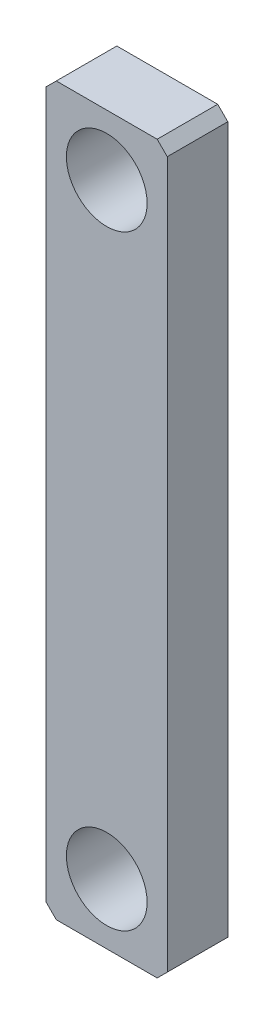
ISO-10303-21;
HEADER;
FILE_DESCRIPTION(('STEP AP214'),'2;1');
FILE_NAME('part.step','',(''),(''),'','','');
FILE_SCHEMA(('AUTOMOTIVE_DESIGN { 1 0 10303 214 1 1 1 1 }'));
ENDSEC;
DATA;
#1=APPLICATION_CONTEXT('core data for automotive mechanical design processes');
#2=APPLICATION_PROTOCOL_DEFINITION('international standard','automotive_design',2000,#1);
#3=PRODUCT_CONTEXT('',#1,'mechanical');
#4=PRODUCT('Part','Part','',(#3));
#5=PRODUCT_RELATED_PRODUCT_CATEGORY('part','',(#4));
#6=PRODUCT_DEFINITION_FORMATION('','',#4);
#7=PRODUCT_DEFINITION_CONTEXT('part definition',#1,'design');
#8=PRODUCT_DEFINITION('design','',#6,#7);
#9=PRODUCT_DEFINITION_SHAPE('','',#8);
#10=(LENGTH_UNIT() NAMED_UNIT(*) SI_UNIT(.MILLI.,.METRE.));
#11=(NAMED_UNIT(*) PLANE_ANGLE_UNIT() SI_UNIT($,.RADIAN.));
#12=(NAMED_UNIT(*) SI_UNIT($,.STERADIAN.) SOLID_ANGLE_UNIT());
#13=UNCERTAINTY_MEASURE_WITH_UNIT(LENGTH_MEASURE(1.E-05),#10,'distance_accuracy_value','');
#14=(GEOMETRIC_REPRESENTATION_CONTEXT(3) GLOBAL_UNCERTAINTY_ASSIGNED_CONTEXT((#13)) GLOBAL_UNIT_ASSIGNED_CONTEXT((#10,
#11,#12)) REPRESENTATION_CONTEXT('',''));
#15=CARTESIAN_POINT('',(0.,0.,0.));
#16=DIRECTION('',(0.,0.,1.));
#17=DIRECTION('',(1.,0.,0.));
#18=AXIS2_PLACEMENT_3D('',#15,#16,#17);
#19=CARTESIAN_POINT('',(6.,36.,6.));
#20=DIRECTION('',(-1.,0.,0.));
#21=DIRECTION('',(0.,-1.,0.));
#22=AXIS2_PLACEMENT_3D('',#19,#20,#21);
#23=PLANE('',#22);
#24=DIRECTION('',(0.,1.,0.));
#25=VECTOR('',#24,1.);
#26=CARTESIAN_POINT('',(6.,36.,6.));
#27=LINE('',#26,#25);
#28=CARTESIAN_POINT('',(6.,-35.,6.));
#29=VERTEX_POINT('',#28);
#30=CARTESIAN_POINT('',(6.,35.,6.));
#31=VERTEX_POINT('',#30);
#32=EDGE_CURVE('E131',#29,#31,#27,.T.);
#33=ORIENTED_EDGE('',*,*,#32,.F.);
#34=DIRECTION('',(0.,0.,-1.));
#35=VECTOR('',#34,1.);
#36=CARTESIAN_POINT('',(6.,-35.,6.));
#37=LINE('',#36,#35);
#38=CARTESIAN_POINT('',(6.,-35.,0.));
#39=VERTEX_POINT('',#38);
#40=EDGE_CURVE('E116',#29,#39,#37,.T.);
#41=ORIENTED_EDGE('',*,*,#40,.T.);
#42=DIRECTION('',(0.,1.,0.));
#43=VECTOR('',#42,1.);
#44=CARTESIAN_POINT('',(6.,36.,0.));
#45=LINE('',#44,#43);
#46=CARTESIAN_POINT('',(6.,35.,0.));
#47=VERTEX_POINT('',#46);
#48=EDGE_CURVE('E128',#39,#47,#45,.T.);
#49=ORIENTED_EDGE('',*,*,#48,.T.);
#50=DIRECTION('',(0.,0.,1.));
#51=VECTOR('',#50,1.);
#52=CARTESIAN_POINT('',(6.,35.,6.));
#53=LINE('',#52,#51);
#54=EDGE_CURVE('E133',#47,#31,#53,.T.);
#55=ORIENTED_EDGE('',*,*,#54,.T.);
#56=EDGE_LOOP('',(#33,#41,#49,#55));
#57=FACE_BOUND('',#56,.T.);
#58=ADVANCED_FACE('F45',(#57),#23,.F.);
#59=CARTESIAN_POINT('',(-6.00000000000001,36.,6.));
#60=DIRECTION('',(0.,-1.,0.));
#61=DIRECTION('',(0.,0.,-1.));
#62=AXIS2_PLACEMENT_3D('',#59,#60,#61);
#63=PLANE('',#62);
#64=DIRECTION('',(-1.,0.,0.));
#65=VECTOR('',#64,1.);
#66=CARTESIAN_POINT('',(-6.00000000000001,36.,0.));
#67=LINE('',#66,#65);
#68=CARTESIAN_POINT('',(4.99999999999999,36.,0.));
#69=VERTEX_POINT('',#68);
#70=CARTESIAN_POINT('',(-4.99999999999999,36.,0.));
#71=VERTEX_POINT('',#70);
#72=EDGE_CURVE('E137',#69,#71,#67,.T.);
#73=ORIENTED_EDGE('',*,*,#72,.T.);
#74=DIRECTION('',(0.,0.,1.));
#75=VECTOR('',#74,1.);
#76=CARTESIAN_POINT('',(-4.99999999999998,36.,6.));
#77=LINE('',#76,#75);
#78=CARTESIAN_POINT('',(-4.99999999999999,36.,6.));
#79=VERTEX_POINT('',#78);
#80=EDGE_CURVE('E11',#71,#79,#77,.T.);
#81=ORIENTED_EDGE('',*,*,#80,.T.);
#82=DIRECTION('',(-1.,0.,0.));
#83=VECTOR('',#82,1.);
#84=CARTESIAN_POINT('',(-6.00000000000001,36.,6.));
#85=LINE('',#84,#83);
#86=CARTESIAN_POINT('',(4.99999999999999,36.,6.));
#87=VERTEX_POINT('',#86);
#88=EDGE_CURVE('E177',#87,#79,#85,.T.);
#89=ORIENTED_EDGE('',*,*,#88,.F.);
#90=DIRECTION('',(0.,0.,-1.));
#91=VECTOR('',#90,1.);
#92=CARTESIAN_POINT('',(4.99999999999999,36.,6.));
#93=LINE('',#92,#91);
#94=EDGE_CURVE('E54',#87,#69,#93,.T.);
#95=ORIENTED_EDGE('',*,*,#94,.T.);
#96=EDGE_LOOP('',(#73,#81,#89,#95));
#97=FACE_BOUND('',#96,.T.);
#98=ADVANCED_FACE('F175',(#97),#63,.F.);
#99=CARTESIAN_POINT('',(-6.00000000000001,36.,6.));
#100=DIRECTION('',(1.,0.,0.));
#101=DIRECTION('',(0.,1.,0.));
#102=AXIS2_PLACEMENT_3D('',#99,#100,#101);
#103=PLANE('',#102);
#104=DIRECTION('',(0.,-1.,0.));
#105=VECTOR('',#104,1.);
#106=CARTESIAN_POINT('',(-6.00000000000001,36.,0.));
#107=LINE('',#106,#105);
#108=CARTESIAN_POINT('',(-6.00000000000001,35.,0.));
#109=VERTEX_POINT('',#108);
#110=CARTESIAN_POINT('',(-6.,-35.,0.));
#111=VERTEX_POINT('',#110);
#112=EDGE_CURVE('E141',#109,#111,#107,.T.);
#113=ORIENTED_EDGE('',*,*,#112,.T.);
#114=DIRECTION('',(0.,0.,1.));
#115=VECTOR('',#114,1.);
#116=CARTESIAN_POINT('',(-6.,-35.,6.));
#117=LINE('',#116,#115);
#118=CARTESIAN_POINT('',(-6.,-35.,6.));
#119=VERTEX_POINT('',#118);
#120=EDGE_CURVE('E61',#111,#119,#117,.T.);
#121=ORIENTED_EDGE('',*,*,#120,.T.);
#122=DIRECTION('',(0.,-1.,0.));
#123=VECTOR('',#122,1.);
#124=CARTESIAN_POINT('',(-6.00000000000001,36.,6.));
#125=LINE('',#124,#123);
#126=CARTESIAN_POINT('',(-6.00000000000001,35.,6.));
#127=VERTEX_POINT('',#126);
#128=EDGE_CURVE('E185',#127,#119,#125,.T.);
#129=ORIENTED_EDGE('',*,*,#128,.F.);
#130=DIRECTION('',(0.,0.,-1.));
#131=VECTOR('',#130,1.);
#132=CARTESIAN_POINT('',(-6.00000000000001,35.,6.));
#133=LINE('',#132,#131);
#134=EDGE_CURVE('E168',#127,#109,#133,.T.);
#135=ORIENTED_EDGE('',*,*,#134,.T.);
#136=EDGE_LOOP('',(#113,#121,#129,#135));
#137=FACE_BOUND('',#136,.T.);
#138=ADVANCED_FACE('F184',(#137),#103,.F.);
#139=CARTESIAN_POINT('',(-6.,-36.,6.));
#140=DIRECTION('',(0.,1.,0.));
#141=DIRECTION('',(0.,0.,1.));
#142=AXIS2_PLACEMENT_3D('',#139,#140,#141);
#143=PLANE('',#142);
#144=DIRECTION('',(1.,0.,0.));
#145=VECTOR('',#144,1.);
#146=CARTESIAN_POINT('',(-6.,-36.,0.));
#147=LINE('',#146,#145);
#148=CARTESIAN_POINT('',(-5.,-36.,0.));
#149=VERTEX_POINT('',#148);
#150=CARTESIAN_POINT('',(5.,-36.,0.));
#151=VERTEX_POINT('',#150);
#152=EDGE_CURVE('E151',#149,#151,#147,.T.);
#153=ORIENTED_EDGE('',*,*,#152,.T.);
#154=DIRECTION('',(0.,0.,1.));
#155=VECTOR('',#154,1.);
#156=CARTESIAN_POINT('',(5.,-36.,6.));
#157=LINE('',#156,#155);
#158=CARTESIAN_POINT('',(5.,-36.,6.));
#159=VERTEX_POINT('',#158);
#160=EDGE_CURVE('E117',#151,#159,#157,.T.);
#161=ORIENTED_EDGE('',*,*,#160,.T.);
#162=DIRECTION('',(1.,0.,0.));
#163=VECTOR('',#162,1.);
#164=CARTESIAN_POINT('',(-6.,-36.,6.));
#165=LINE('',#164,#163);
#166=CARTESIAN_POINT('',(-5.,-36.,6.));
#167=VERTEX_POINT('',#166);
#168=EDGE_CURVE('E147',#167,#159,#165,.T.);
#169=ORIENTED_EDGE('',*,*,#168,.F.);
#170=DIRECTION('',(0.,0.,-1.));
#171=VECTOR('',#170,1.);
#172=CARTESIAN_POINT('',(-5.,-36.,6.));
#173=LINE('',#172,#171);
#174=EDGE_CURVE('E122',#167,#149,#173,.T.);
#175=ORIENTED_EDGE('',*,*,#174,.T.);
#176=EDGE_LOOP('',(#153,#161,#169,#175));
#177=FACE_BOUND('',#176,.T.);
#178=ADVANCED_FACE('F244',(#177),#143,.F.);
#179=CARTESIAN_POINT('',(0.,0.,6.));
#180=DIRECTION('',(0.,0.,1.));
#181=DIRECTION('',(1.,0.,0.));
#182=AXIS2_PLACEMENT_3D('',#179,#180,#181);
#183=PLANE('',#182);
#184=CARTESIAN_POINT('',(0.,30.,6.));
#185=DIRECTION('',(0.,0.,1.));
#186=DIRECTION('',(1.,0.,0.));
#187=AXIS2_PLACEMENT_3D('',#184,#185,#186);
#188=CIRCLE('',#187,4.);
#189=CARTESIAN_POINT('',(4.,30.,6.));
#190=VERTEX_POINT('',#189);
#191=EDGE_CURVE('E138',#190,#190,#188,.T.);
#192=ORIENTED_EDGE('',*,*,#191,.F.);
#193=EDGE_LOOP('',(#192));
#194=FACE_BOUND('',#193,.T.);
#195=CARTESIAN_POINT('',(0.,-30.,6.));
#196=DIRECTION('',(0.,0.,1.));
#197=DIRECTION('',(1.,0.,0.));
#198=AXIS2_PLACEMENT_3D('',#195,#196,#197);
#199=CIRCLE('',#198,4.);
#200=CARTESIAN_POINT('',(4.,-30.,6.));
#201=VERTEX_POINT('',#200);
#202=EDGE_CURVE('E144',#201,#201,#199,.T.);
#203=ORIENTED_EDGE('',*,*,#202,.F.);
#204=EDGE_LOOP('',(#203));
#205=FACE_BOUND('',#204,.T.);
#206=ORIENTED_EDGE('',*,*,#168,.T.);
#207=DIRECTION('',(-0.707106781186552,-0.707106781186543,0.));
#208=VECTOR('',#207,1.);
#209=CARTESIAN_POINT('',(20.5,-20.5000000000002,6.));
#210=LINE('',#209,#208);
#211=EDGE_CURVE('E166',#159,#29,#210,.F.);
#212=ORIENTED_EDGE('',*,*,#211,.T.);
#213=ORIENTED_EDGE('',*,*,#32,.T.);
#214=DIRECTION('',(0.707106781186545,-0.70710678118655,0.));
#215=VECTOR('',#214,1.);
#216=CARTESIAN_POINT('',(20.5,20.4999999999999,6.));
#217=LINE('',#216,#215);
#218=EDGE_CURVE('E161',#31,#87,#217,.F.);
#219=ORIENTED_EDGE('',*,*,#218,.T.);
#220=ORIENTED_EDGE('',*,*,#88,.T.);
#221=DIRECTION('',(0.707106781186552,0.707106781186543,0.));
#222=VECTOR('',#221,1.);
#223=CARTESIAN_POINT('',(-20.5,20.5000000000002,6.));
#224=LINE('',#223,#222);
#225=EDGE_CURVE('E68',#79,#127,#224,.F.);
#226=ORIENTED_EDGE('',*,*,#225,.T.);
#227=ORIENTED_EDGE('',*,*,#128,.T.);
#228=DIRECTION('',(-0.707106781186543,0.707106781186552,0.));
#229=VECTOR('',#228,1.);
#230=CARTESIAN_POINT('',(-20.5,-20.4999999999997,6.));
#231=LINE('',#230,#229);
#232=EDGE_CURVE('E164',#119,#167,#231,.F.);
#233=ORIENTED_EDGE('',*,*,#232,.T.);
#234=EDGE_LOOP('',(#206,#212,#213,#219,#220,#226,#227,#233));
#235=FACE_BOUND('',#234,.T.);
#236=ADVANCED_FACE('F240',(#194,#205,#235),#183,.T.);
#237=CARTESIAN_POINT('',(0.,0.,0.));
#238=DIRECTION('',(0.,0.,1.));
#239=DIRECTION('',(1.,0.,0.));
#240=AXIS2_PLACEMENT_3D('',#237,#238,#239);
#241=PLANE('',#240);
#242=CARTESIAN_POINT('',(0.,30.,0.));
#243=DIRECTION('',(0.,0.,1.));
#244=DIRECTION('',(1.,0.,0.));
#245=AXIS2_PLACEMENT_3D('',#242,#243,#244);
#246=CIRCLE('',#245,4.);
#247=CARTESIAN_POINT('',(4.,30.,0.));
#248=VERTEX_POINT('',#247);
#249=EDGE_CURVE('E193',#248,#248,#246,.T.);
#250=ORIENTED_EDGE('',*,*,#249,.T.);
#251=EDGE_LOOP('',(#250));
#252=FACE_BOUND('',#251,.T.);
#253=CARTESIAN_POINT('',(0.,-30.,0.));
#254=DIRECTION('',(0.,0.,1.));
#255=DIRECTION('',(1.,0.,0.));
#256=AXIS2_PLACEMENT_3D('',#253,#254,#255);
#257=CIRCLE('',#256,4.);
#258=CARTESIAN_POINT('',(4.,-30.,0.));
#259=VERTEX_POINT('',#258);
#260=EDGE_CURVE('E194',#259,#259,#257,.T.);
#261=ORIENTED_EDGE('',*,*,#260,.T.);
#262=EDGE_LOOP('',(#261));
#263=FACE_BOUND('',#262,.T.);
#264=ORIENTED_EDGE('',*,*,#48,.F.);
#265=DIRECTION('',(0.707106781186552,0.707106781186543,0.));
#266=VECTOR('',#265,1.);
#267=CARTESIAN_POINT('',(6.,-35.,0.));
#268=LINE('',#267,#266);
#269=EDGE_CURVE('E112',#39,#151,#268,.F.);
#270=ORIENTED_EDGE('',*,*,#269,.T.);
#271=ORIENTED_EDGE('',*,*,#152,.F.);
#272=DIRECTION('',(0.707106781186543,-0.707106781186552,0.));
#273=VECTOR('',#272,1.);
#274=CARTESIAN_POINT('',(-5.,-36.,0.));
#275=LINE('',#274,#273);
#276=EDGE_CURVE('E123',#149,#111,#275,.F.);
#277=ORIENTED_EDGE('',*,*,#276,.T.);
#278=ORIENTED_EDGE('',*,*,#112,.F.);
#279=DIRECTION('',(-0.707106781186552,-0.707106781186543,0.));
#280=VECTOR('',#279,1.);
#281=CARTESIAN_POINT('',(-6.00000000000001,35.,0.));
#282=LINE('',#281,#280);
#283=EDGE_CURVE('E155',#109,#71,#282,.F.);
#284=ORIENTED_EDGE('',*,*,#283,.T.);
#285=ORIENTED_EDGE('',*,*,#72,.F.);
#286=DIRECTION('',(-0.707106781186545,0.70710678118655,0.));
#287=VECTOR('',#286,1.);
#288=CARTESIAN_POINT('',(4.99999999999999,36.,0.));
#289=LINE('',#288,#287);
#290=EDGE_CURVE('E132',#69,#47,#289,.F.);
#291=ORIENTED_EDGE('',*,*,#290,.T.);
#292=EDGE_LOOP('',(#264,#270,#271,#277,#278,#284,#285,#291));
#293=FACE_BOUND('',#292,.T.);
#294=ADVANCED_FACE('F135',(#252,#263,#293),#241,.F.);
#295=CARTESIAN_POINT('',(0.,-30.,0.));
#296=DIRECTION('',(0.,0.,1.));
#297=DIRECTION('',(1.,0.,0.));
#298=AXIS2_PLACEMENT_3D('',#295,#296,#297);
#299=CYLINDRICAL_SURFACE('',#298,4.);
#300=ORIENTED_EDGE('',*,*,#202,.T.);
#301=EDGE_LOOP('',(#300));
#302=FACE_BOUND('',#301,.T.);
#303=ORIENTED_EDGE('',*,*,#260,.F.);
#304=EDGE_LOOP('',(#303));
#305=FACE_BOUND('',#304,.T.);
#306=ADVANCED_FACE('F204',(#302,#305),#299,.F.);
#307=CARTESIAN_POINT('',(0.,30.,0.));
#308=DIRECTION('',(0.,0.,1.));
#309=DIRECTION('',(1.,0.,0.));
#310=AXIS2_PLACEMENT_3D('',#307,#308,#309);
#311=CYLINDRICAL_SURFACE('',#310,4.);
#312=ORIENTED_EDGE('',*,*,#191,.T.);
#313=EDGE_LOOP('',(#312));
#314=FACE_BOUND('',#313,.T.);
#315=ORIENTED_EDGE('',*,*,#249,.F.);
#316=EDGE_LOOP('',(#315));
#317=FACE_BOUND('',#316,.T.);
#318=ADVANCED_FACE('F202',(#314,#317),#311,.F.);
#319=CARTESIAN_POINT('',(6.,-35.,6.));
#320=DIRECTION('',(-0.707106781186543,0.707106781186552,0.));
#321=DIRECTION('',(0.,0.,-1.));
#322=AXIS2_PLACEMENT_3D('',#319,#320,#321);
#323=PLANE('',#322);
#324=ORIENTED_EDGE('',*,*,#211,.F.);
#325=ORIENTED_EDGE('',*,*,#160,.F.);
#326=ORIENTED_EDGE('',*,*,#269,.F.);
#327=ORIENTED_EDGE('',*,*,#40,.F.);
#328=EDGE_LOOP('',(#324,#325,#326,#327));
#329=FACE_BOUND('',#328,.T.);
#330=ADVANCED_FACE('F115',(#329),#323,.F.);
#331=CARTESIAN_POINT('',(-5.,-36.,6.));
#332=DIRECTION('',(0.707106781186552,0.707106781186542,0.));
#333=DIRECTION('',(0.,0.,-1.));
#334=AXIS2_PLACEMENT_3D('',#331,#332,#333);
#335=PLANE('',#334);
#336=ORIENTED_EDGE('',*,*,#232,.F.);
#337=ORIENTED_EDGE('',*,*,#120,.F.);
#338=ORIENTED_EDGE('',*,*,#276,.F.);
#339=ORIENTED_EDGE('',*,*,#174,.F.);
#340=EDGE_LOOP('',(#336,#337,#338,#339));
#341=FACE_BOUND('',#340,.T.);
#342=ADVANCED_FACE('F212',(#341),#335,.F.);
#343=CARTESIAN_POINT('',(-6.00000000000001,35.,6.));
#344=DIRECTION('',(0.707106781186543,-0.707106781186552,0.));
#345=DIRECTION('',(0.,0.,-1.));
#346=AXIS2_PLACEMENT_3D('',#343,#344,#345);
#347=PLANE('',#346);
#348=ORIENTED_EDGE('',*,*,#225,.F.);
#349=ORIENTED_EDGE('',*,*,#80,.F.);
#350=ORIENTED_EDGE('',*,*,#283,.F.);
#351=ORIENTED_EDGE('',*,*,#134,.F.);
#352=EDGE_LOOP('',(#348,#349,#350,#351));
#353=FACE_BOUND('',#352,.T.);
#354=ADVANCED_FACE('F183',(#353),#347,.F.);
#355=CARTESIAN_POINT('',(4.99999999999999,36.,6.));
#356=DIRECTION('',(-0.70710678118655,-0.707106781186545,0.));
#357=DIRECTION('',(0.,0.,-1.));
#358=AXIS2_PLACEMENT_3D('',#355,#356,#357);
#359=PLANE('',#358);
#360=ORIENTED_EDGE('',*,*,#218,.F.);
#361=ORIENTED_EDGE('',*,*,#54,.F.);
#362=ORIENTED_EDGE('',*,*,#290,.F.);
#363=ORIENTED_EDGE('',*,*,#94,.F.);
#364=EDGE_LOOP('',(#360,#361,#362,#363));
#365=FACE_BOUND('',#364,.T.);
#366=ADVANCED_FACE('F48',(#365),#359,.F.);
#367=CLOSED_SHELL('',(#58,#98,#138,#178,#236,#294,#306,#318,#330,#342,#354,#366));
#368=MANIFOLD_SOLID_BREP('B2',#367);
#369=ADVANCED_BREP_SHAPE_REPRESENTATION('',(#18,#368),#14);
#370=SHAPE_DEFINITION_REPRESENTATION(#9,#369);
ENDSEC;
END-ISO-10303-21;
